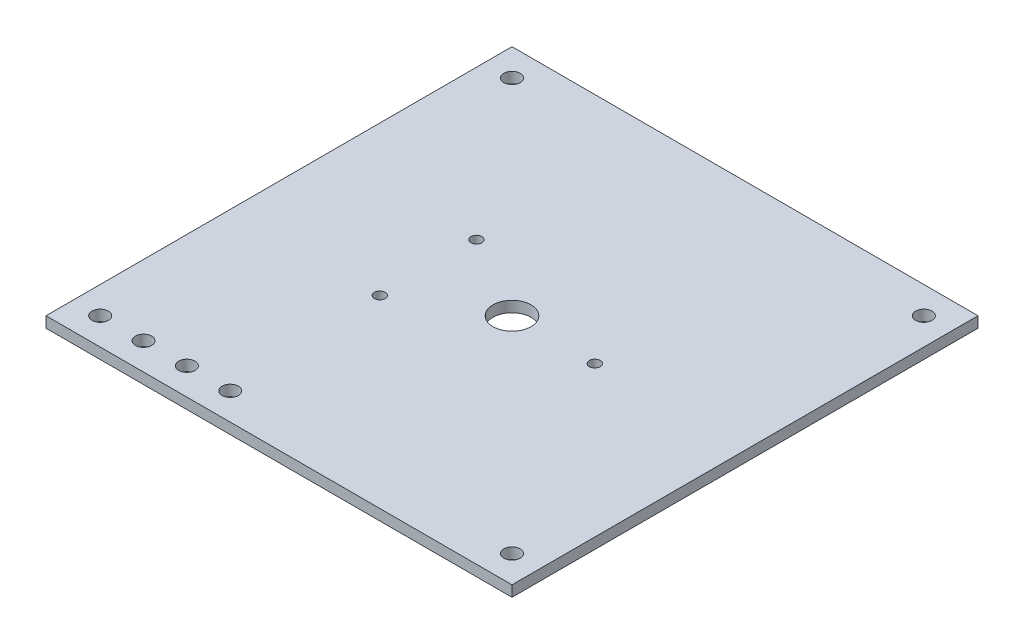
ISO-10303-21;
HEADER;
FILE_DESCRIPTION(('STEP AP214'),'2;1');
FILE_NAME('part.step','',(''),(''),'','','');
FILE_SCHEMA(('AUTOMOTIVE_DESIGN { 1 0 10303 214 1 1 1 1 }'));
ENDSEC;
DATA;
#1=APPLICATION_CONTEXT('core data for automotive mechanical design processes');
#2=APPLICATION_PROTOCOL_DEFINITION('international standard','automotive_design',2000,#1);
#3=PRODUCT_CONTEXT('',#1,'mechanical');
#4=PRODUCT('Part','Part','',(#3));
#5=PRODUCT_RELATED_PRODUCT_CATEGORY('part','',(#4));
#6=PRODUCT_DEFINITION_FORMATION('','',#4);
#7=PRODUCT_DEFINITION_CONTEXT('part definition',#1,'design');
#8=PRODUCT_DEFINITION('design','',#6,#7);
#9=PRODUCT_DEFINITION_SHAPE('','',#8);
#10=(LENGTH_UNIT() NAMED_UNIT(*) SI_UNIT(.MILLI.,.METRE.));
#11=(NAMED_UNIT(*) PLANE_ANGLE_UNIT() SI_UNIT($,.RADIAN.));
#12=(NAMED_UNIT(*) SI_UNIT($,.STERADIAN.) SOLID_ANGLE_UNIT());
#13=UNCERTAINTY_MEASURE_WITH_UNIT(LENGTH_MEASURE(1.E-05),#10,'distance_accuracy_value','');
#14=(GEOMETRIC_REPRESENTATION_CONTEXT(3) GLOBAL_UNCERTAINTY_ASSIGNED_CONTEXT((#13)) GLOBAL_UNIT_ASSIGNED_CONTEXT((#10,
#11,#12)) REPRESENTATION_CONTEXT('',''));
#15=CARTESIAN_POINT('',(0.,0.,0.));
#16=DIRECTION('',(0.,0.,1.));
#17=DIRECTION('',(1.,0.,0.));
#18=AXIS2_PLACEMENT_3D('',#15,#16,#17);
#19=CARTESIAN_POINT('',(0.,6.35,0.));
#20=DIRECTION('',(0.,1.,0.));
#21=DIRECTION('',(0.,0.,1.));
#22=AXIS2_PLACEMENT_3D('',#19,#20,#21);
#23=PLANE('',#22);
#24=CARTESIAN_POINT('',(48.514,6.35,0.));
#25=DIRECTION('',(0.,1.,0.));
#26=DIRECTION('',(0.,0.,1.));
#27=AXIS2_PLACEMENT_3D('',#24,#25,#26);
#28=CIRCLE('',#27,3.175);
#29=CARTESIAN_POINT('',(48.514,6.35,3.175));
#30=VERTEX_POINT('',#29);
#31=EDGE_CURVE('E172',#30,#30,#28,.T.);
#32=ORIENTED_EDGE('',*,*,#31,.F.);
#33=EDGE_LOOP('',(#32));
#34=FACE_BOUND('',#33,.T.);
#35=CARTESIAN_POINT('',(-49.022,6.35,28.446));
#36=DIRECTION('',(0.,1.,0.));
#37=DIRECTION('',(0.,0.,1.));
#38=AXIS2_PLACEMENT_3D('',#35,#36,#37);
#39=CIRCLE('',#38,3.175);
#40=CARTESIAN_POINT('',(-49.022,6.35,31.621));
#41=VERTEX_POINT('',#40);
#42=EDGE_CURVE('E166',#41,#41,#39,.T.);
#43=ORIENTED_EDGE('',*,*,#42,.F.);
#44=EDGE_LOOP('',(#43));
#45=FACE_BOUND('',#44,.T.);
#46=CARTESIAN_POINT('',(-49.0220000000002,6.35,-28.194));
#47=DIRECTION('',(0.,1.,0.));
#48=DIRECTION('',(0.,0.,1.));
#49=AXIS2_PLACEMENT_3D('',#46,#47,#48);
#50=CIRCLE('',#49,3.175);
#51=CARTESIAN_POINT('',(-49.0220000000002,6.35,-25.019));
#52=VERTEX_POINT('',#51);
#53=EDGE_CURVE('E160',#52,#52,#50,.T.);
#54=ORIENTED_EDGE('',*,*,#53,.F.);
#55=EDGE_LOOP('',(#54));
#56=FACE_BOUND('',#55,.T.);
#57=CARTESIAN_POINT('',(-44.45,6.35,120.65));
#58=DIRECTION('',(0.,1.,0.));
#59=DIRECTION('',(0.,0.,1.));
#60=AXIS2_PLACEMENT_3D('',#57,#58,#59);
#61=CIRCLE('',#60,4.7625);
#62=CARTESIAN_POINT('',(-44.45,6.35,125.4125));
#63=VERTEX_POINT('',#62);
#64=EDGE_CURVE('E154',#63,#63,#61,.T.);
#65=ORIENTED_EDGE('',*,*,#64,.F.);
#66=EDGE_LOOP('',(#65));
#67=FACE_BOUND('',#66,.T.);
#68=CARTESIAN_POINT('',(-69.85,6.35,120.65));
#69=DIRECTION('',(0.,1.,0.));
#70=DIRECTION('',(0.,0.,1.));
#71=AXIS2_PLACEMENT_3D('',#68,#69,#70);
#72=CIRCLE('',#71,4.76250000000001);
#73=CARTESIAN_POINT('',(-69.85,6.35,125.4125));
#74=VERTEX_POINT('',#73);
#75=EDGE_CURVE('E148',#74,#74,#72,.T.);
#76=ORIENTED_EDGE('',*,*,#75,.F.);
#77=EDGE_LOOP('',(#76));
#78=FACE_BOUND('',#77,.T.);
#79=CARTESIAN_POINT('',(-95.25,6.35,120.65));
#80=DIRECTION('',(0.,1.,0.));
#81=DIRECTION('',(0.,0.,1.));
#82=AXIS2_PLACEMENT_3D('',#79,#80,#81);
#83=CIRCLE('',#82,4.7625);
#84=CARTESIAN_POINT('',(-95.25,6.35,125.4125));
#85=VERTEX_POINT('',#84);
#86=EDGE_CURVE('E142',#85,#85,#83,.T.);
#87=ORIENTED_EDGE('',*,*,#86,.F.);
#88=EDGE_LOOP('',(#87));
#89=FACE_BOUND('',#88,.T.);
#90=CARTESIAN_POINT('',(120.65,6.35,120.65));
#91=DIRECTION('',(0.,1.,0.));
#92=DIRECTION('',(0.,0.,1.));
#93=AXIS2_PLACEMENT_3D('',#90,#91,#92);
#94=CIRCLE('',#93,4.7625);
#95=CARTESIAN_POINT('',(120.65,6.35,125.4125));
#96=VERTEX_POINT('',#95);
#97=EDGE_CURVE('E136',#96,#96,#94,.T.);
#98=ORIENTED_EDGE('',*,*,#97,.F.);
#99=EDGE_LOOP('',(#98));
#100=FACE_BOUND('',#99,.T.);
#101=CARTESIAN_POINT('',(120.65,6.35,-120.65));
#102=DIRECTION('',(0.,1.,0.));
#103=DIRECTION('',(0.,0.,-1.));
#104=AXIS2_PLACEMENT_3D('',#101,#102,#103);
#105=CIRCLE('',#104,4.7625);
#106=CARTESIAN_POINT('',(120.65,6.35,-125.4125));
#107=VERTEX_POINT('',#106);
#108=EDGE_CURVE('E130',#107,#107,#105,.T.);
#109=ORIENTED_EDGE('',*,*,#108,.F.);
#110=EDGE_LOOP('',(#109));
#111=FACE_BOUND('',#110,.T.);
#112=CARTESIAN_POINT('',(-120.65,6.35,120.65));
#113=DIRECTION('',(0.,1.,0.));
#114=DIRECTION('',(0.,0.,-1.));
#115=AXIS2_PLACEMENT_3D('',#112,#113,#114);
#116=CIRCLE('',#115,4.7625);
#117=CARTESIAN_POINT('',(-120.65,6.35,115.8875));
#118=VERTEX_POINT('',#117);
#119=EDGE_CURVE('E124',#118,#118,#116,.T.);
#120=ORIENTED_EDGE('',*,*,#119,.F.);
#121=EDGE_LOOP('',(#120));
#122=FACE_BOUND('',#121,.T.);
#123=CARTESIAN_POINT('',(-120.65,6.35,-120.65));
#124=DIRECTION('',(0.,1.,0.));
#125=DIRECTION('',(0.,0.,1.));
#126=AXIS2_PLACEMENT_3D('',#123,#124,#125);
#127=CIRCLE('',#126,4.7625);
#128=CARTESIAN_POINT('',(-120.65,6.35,-115.8875));
#129=VERTEX_POINT('',#128);
#130=EDGE_CURVE('E118',#129,#129,#127,.T.);
#131=ORIENTED_EDGE('',*,*,#130,.F.);
#132=EDGE_LOOP('',(#131));
#133=FACE_BOUND('',#132,.T.);
#134=DIRECTION('',(0.,0.,1.));
#135=VECTOR('',#134,1.);
#136=CARTESIAN_POINT('',(-136.525,6.35,136.525));
#137=LINE('',#136,#135);
#138=CARTESIAN_POINT('',(-136.525,6.35,-136.525));
#139=VERTEX_POINT('',#138);
#140=CARTESIAN_POINT('',(-136.525,6.35,136.525));
#141=VERTEX_POINT('',#140);
#142=EDGE_CURVE('E85',#139,#141,#137,.T.);
#143=ORIENTED_EDGE('',*,*,#142,.T.);
#144=DIRECTION('',(1.,0.,0.));
#145=VECTOR('',#144,1.);
#146=CARTESIAN_POINT('',(136.525,6.35,136.525));
#147=LINE('',#146,#145);
#148=CARTESIAN_POINT('',(136.525,6.35,136.525));
#149=VERTEX_POINT('',#148);
#150=EDGE_CURVE('E80',#141,#149,#147,.T.);
#151=ORIENTED_EDGE('',*,*,#150,.T.);
#152=DIRECTION('',(0.,0.,-1.));
#153=VECTOR('',#152,1.);
#154=CARTESIAN_POINT('',(136.525,6.35,136.525));
#155=LINE('',#154,#153);
#156=CARTESIAN_POINT('',(136.525,6.35,-136.525));
#157=VERTEX_POINT('',#156);
#158=EDGE_CURVE('E83',#149,#157,#155,.T.);
#159=ORIENTED_EDGE('',*,*,#158,.T.);
#160=DIRECTION('',(-1.,0.,0.));
#161=VECTOR('',#160,1.);
#162=CARTESIAN_POINT('',(136.525,6.35,-136.525));
#163=LINE('',#162,#161);
#164=EDGE_CURVE('E50',#157,#139,#163,.T.);
#165=ORIENTED_EDGE('',*,*,#164,.T.);
#166=EDGE_LOOP('',(#143,#151,#159,#165));
#167=FACE_BOUND('',#166,.T.);
#168=CARTESIAN_POINT('',(0.,6.35,0.));
#169=DIRECTION('',(0.,1.,0.));
#170=DIRECTION('',(0.,0.,1.));
#171=AXIS2_PLACEMENT_3D('',#168,#169,#170);
#172=CIRCLE('',#171,11.1125);
#173=CARTESIAN_POINT('',(0.,6.35,11.1125));
#174=VERTEX_POINT('',#173);
#175=EDGE_CURVE('E100',#174,#174,#172,.T.);
#176=ORIENTED_EDGE('',*,*,#175,.F.);
#177=EDGE_LOOP('',(#176));
#178=FACE_BOUND('',#177,.T.);
#179=ADVANCED_FACE('F33',(#34,#45,#56,#67,#78,#89,#100,#111,#122,#133,#167,#178),#23,.T.);
#180=CARTESIAN_POINT('',(0.,0.,0.));
#181=DIRECTION('',(0.,1.,0.));
#182=DIRECTION('',(0.,0.,1.));
#183=AXIS2_PLACEMENT_3D('',#180,#181,#182);
#184=PLANE('',#183);
#185=CARTESIAN_POINT('',(48.514,0.,0.));
#186=DIRECTION('',(0.,1.,0.));
#187=DIRECTION('',(0.,0.,1.));
#188=AXIS2_PLACEMENT_3D('',#185,#186,#187);
#189=CIRCLE('',#188,3.175);
#190=CARTESIAN_POINT('',(48.514,0.,3.175));
#191=VERTEX_POINT('',#190);
#192=EDGE_CURVE('E169',#191,#191,#189,.T.);
#193=ORIENTED_EDGE('',*,*,#192,.T.);
#194=EDGE_LOOP('',(#193));
#195=FACE_BOUND('',#194,.T.);
#196=CARTESIAN_POINT('',(-49.022,0.,28.446));
#197=DIRECTION('',(0.,1.,0.));
#198=DIRECTION('',(0.,0.,1.));
#199=AXIS2_PLACEMENT_3D('',#196,#197,#198);
#200=CIRCLE('',#199,3.175);
#201=CARTESIAN_POINT('',(-49.022,0.,31.621));
#202=VERTEX_POINT('',#201);
#203=EDGE_CURVE('E163',#202,#202,#200,.T.);
#204=ORIENTED_EDGE('',*,*,#203,.T.);
#205=EDGE_LOOP('',(#204));
#206=FACE_BOUND('',#205,.T.);
#207=CARTESIAN_POINT('',(-49.0220000000002,0.,-28.194));
#208=DIRECTION('',(0.,1.,0.));
#209=DIRECTION('',(0.,0.,1.));
#210=AXIS2_PLACEMENT_3D('',#207,#208,#209);
#211=CIRCLE('',#210,3.175);
#212=CARTESIAN_POINT('',(-49.0220000000002,0.,-25.019));
#213=VERTEX_POINT('',#212);
#214=EDGE_CURVE('E157',#213,#213,#211,.T.);
#215=ORIENTED_EDGE('',*,*,#214,.T.);
#216=EDGE_LOOP('',(#215));
#217=FACE_BOUND('',#216,.T.);
#218=CARTESIAN_POINT('',(-44.45,0.,120.65));
#219=DIRECTION('',(0.,1.,0.));
#220=DIRECTION('',(0.,0.,1.));
#221=AXIS2_PLACEMENT_3D('',#218,#219,#220);
#222=CIRCLE('',#221,4.7625);
#223=CARTESIAN_POINT('',(-44.45,0.,125.4125));
#224=VERTEX_POINT('',#223);
#225=EDGE_CURVE('E151',#224,#224,#222,.T.);
#226=ORIENTED_EDGE('',*,*,#225,.T.);
#227=EDGE_LOOP('',(#226));
#228=FACE_BOUND('',#227,.T.);
#229=CARTESIAN_POINT('',(-69.85,0.,120.65));
#230=DIRECTION('',(0.,1.,0.));
#231=DIRECTION('',(0.,0.,1.));
#232=AXIS2_PLACEMENT_3D('',#229,#230,#231);
#233=CIRCLE('',#232,4.76250000000001);
#234=CARTESIAN_POINT('',(-69.85,0.,125.4125));
#235=VERTEX_POINT('',#234);
#236=EDGE_CURVE('E145',#235,#235,#233,.T.);
#237=ORIENTED_EDGE('',*,*,#236,.T.);
#238=EDGE_LOOP('',(#237));
#239=FACE_BOUND('',#238,.T.);
#240=CARTESIAN_POINT('',(-95.25,0.,120.65));
#241=DIRECTION('',(0.,1.,0.));
#242=DIRECTION('',(0.,0.,1.));
#243=AXIS2_PLACEMENT_3D('',#240,#241,#242);
#244=CIRCLE('',#243,4.7625);
#245=CARTESIAN_POINT('',(-95.25,0.,125.4125));
#246=VERTEX_POINT('',#245);
#247=EDGE_CURVE('E139',#246,#246,#244,.T.);
#248=ORIENTED_EDGE('',*,*,#247,.T.);
#249=EDGE_LOOP('',(#248));
#250=FACE_BOUND('',#249,.T.);
#251=CARTESIAN_POINT('',(120.65,0.,120.65));
#252=DIRECTION('',(0.,1.,0.));
#253=DIRECTION('',(0.,0.,1.));
#254=AXIS2_PLACEMENT_3D('',#251,#252,#253);
#255=CIRCLE('',#254,4.7625);
#256=CARTESIAN_POINT('',(120.65,0.,125.4125));
#257=VERTEX_POINT('',#256);
#258=EDGE_CURVE('E133',#257,#257,#255,.T.);
#259=ORIENTED_EDGE('',*,*,#258,.T.);
#260=EDGE_LOOP('',(#259));
#261=FACE_BOUND('',#260,.T.);
#262=CARTESIAN_POINT('',(120.65,0.,-120.65));
#263=DIRECTION('',(0.,1.,0.));
#264=DIRECTION('',(0.,0.,-1.));
#265=AXIS2_PLACEMENT_3D('',#262,#263,#264);
#266=CIRCLE('',#265,4.7625);
#267=CARTESIAN_POINT('',(120.65,0.,-125.4125));
#268=VERTEX_POINT('',#267);
#269=EDGE_CURVE('E127',#268,#268,#266,.T.);
#270=ORIENTED_EDGE('',*,*,#269,.T.);
#271=EDGE_LOOP('',(#270));
#272=FACE_BOUND('',#271,.T.);
#273=CARTESIAN_POINT('',(-120.65,0.,120.65));
#274=DIRECTION('',(0.,1.,0.));
#275=DIRECTION('',(0.,0.,-1.));
#276=AXIS2_PLACEMENT_3D('',#273,#274,#275);
#277=CIRCLE('',#276,4.7625);
#278=CARTESIAN_POINT('',(-120.65,0.,115.8875));
#279=VERTEX_POINT('',#278);
#280=EDGE_CURVE('E121',#279,#279,#277,.T.);
#281=ORIENTED_EDGE('',*,*,#280,.T.);
#282=EDGE_LOOP('',(#281));
#283=FACE_BOUND('',#282,.T.);
#284=CARTESIAN_POINT('',(-120.65,0.,-120.65));
#285=DIRECTION('',(0.,1.,0.));
#286=DIRECTION('',(0.,0.,1.));
#287=AXIS2_PLACEMENT_3D('',#284,#285,#286);
#288=CIRCLE('',#287,4.7625);
#289=CARTESIAN_POINT('',(-120.65,0.,-115.8875));
#290=VERTEX_POINT('',#289);
#291=EDGE_CURVE('E115',#290,#290,#288,.T.);
#292=ORIENTED_EDGE('',*,*,#291,.T.);
#293=EDGE_LOOP('',(#292));
#294=FACE_BOUND('',#293,.T.);
#295=DIRECTION('',(0.,0.,1.));
#296=VECTOR('',#295,1.);
#297=CARTESIAN_POINT('',(-136.525,0.,136.525));
#298=LINE('',#297,#296);
#299=CARTESIAN_POINT('',(-136.525,0.,-136.525));
#300=VERTEX_POINT('',#299);
#301=CARTESIAN_POINT('',(-136.525,0.,136.525));
#302=VERTEX_POINT('',#301);
#303=EDGE_CURVE('E97',#300,#302,#298,.T.);
#304=ORIENTED_EDGE('',*,*,#303,.F.);
#305=DIRECTION('',(-1.,0.,0.));
#306=VECTOR('',#305,1.);
#307=CARTESIAN_POINT('',(136.525,0.,-136.525));
#308=LINE('',#307,#306);
#309=CARTESIAN_POINT('',(136.525,0.,-136.525));
#310=VERTEX_POINT('',#309);
#311=EDGE_CURVE('E73',#310,#300,#308,.T.);
#312=ORIENTED_EDGE('',*,*,#311,.F.);
#313=DIRECTION('',(0.,0.,-1.));
#314=VECTOR('',#313,1.);
#315=CARTESIAN_POINT('',(136.525,0.,136.525));
#316=LINE('',#315,#314);
#317=CARTESIAN_POINT('',(136.525,0.,136.525));
#318=VERTEX_POINT('',#317);
#319=EDGE_CURVE('E67',#318,#310,#316,.T.);
#320=ORIENTED_EDGE('',*,*,#319,.F.);
#321=DIRECTION('',(1.,0.,0.));
#322=VECTOR('',#321,1.);
#323=CARTESIAN_POINT('',(136.525,0.,136.525));
#324=LINE('',#323,#322);
#325=EDGE_CURVE('E89',#302,#318,#324,.T.);
#326=ORIENTED_EDGE('',*,*,#325,.F.);
#327=EDGE_LOOP('',(#304,#312,#320,#326));
#328=FACE_BOUND('',#327,.T.);
#329=CARTESIAN_POINT('',(0.,0.,0.));
#330=DIRECTION('',(0.,1.,0.));
#331=DIRECTION('',(0.,0.,1.));
#332=AXIS2_PLACEMENT_3D('',#329,#330,#331);
#333=CIRCLE('',#332,11.1125);
#334=CARTESIAN_POINT('',(0.,0.,11.1125));
#335=VERTEX_POINT('',#334);
#336=EDGE_CURVE('E112',#335,#335,#333,.T.);
#337=ORIENTED_EDGE('',*,*,#336,.T.);
#338=EDGE_LOOP('',(#337));
#339=FACE_BOUND('',#338,.T.);
#340=ADVANCED_FACE('F108',(#195,#206,#217,#228,#239,#250,#261,#272,#283,#294,#328,#339),#184,.F.);
#341=CARTESIAN_POINT('',(-136.525,6.35,136.525));
#342=DIRECTION('',(1.,0.,0.));
#343=DIRECTION('',(0.,0.,-1.));
#344=AXIS2_PLACEMENT_3D('',#341,#342,#343);
#345=PLANE('',#344);
#346=ORIENTED_EDGE('',*,*,#303,.T.);
#347=DIRECTION('',(0.,-1.,0.));
#348=VECTOR('',#347,1.);
#349=CARTESIAN_POINT('',(-136.525,6.35,136.525));
#350=LINE('',#349,#348);
#351=EDGE_CURVE('E11',#141,#302,#350,.T.);
#352=ORIENTED_EDGE('',*,*,#351,.F.);
#353=ORIENTED_EDGE('',*,*,#142,.F.);
#354=DIRECTION('',(0.,-1.,0.));
#355=VECTOR('',#354,1.);
#356=CARTESIAN_POINT('',(-136.525,6.35,-136.525));
#357=LINE('',#356,#355);
#358=EDGE_CURVE('E93',#139,#300,#357,.T.);
#359=ORIENTED_EDGE('',*,*,#358,.T.);
#360=EDGE_LOOP('',(#346,#352,#353,#359));
#361=FACE_BOUND('',#360,.T.);
#362=ADVANCED_FACE('F35',(#361),#345,.F.);
#363=CARTESIAN_POINT('',(136.525,6.35,136.525));
#364=DIRECTION('',(0.,0.,-1.));
#365=DIRECTION('',(-1.,0.,0.));
#366=AXIS2_PLACEMENT_3D('',#363,#364,#365);
#367=PLANE('',#366);
#368=ORIENTED_EDGE('',*,*,#325,.T.);
#369=DIRECTION('',(0.,-1.,0.));
#370=VECTOR('',#369,1.);
#371=CARTESIAN_POINT('',(136.525,6.35,136.525));
#372=LINE('',#371,#370);
#373=EDGE_CURVE('E42',#149,#318,#372,.T.);
#374=ORIENTED_EDGE('',*,*,#373,.F.);
#375=ORIENTED_EDGE('',*,*,#150,.F.);
#376=ORIENTED_EDGE('',*,*,#351,.T.);
#377=EDGE_LOOP('',(#368,#374,#375,#376));
#378=FACE_BOUND('',#377,.T.);
#379=ADVANCED_FACE('F88',(#378),#367,.F.);
#380=CARTESIAN_POINT('',(136.525,6.35,136.525));
#381=DIRECTION('',(-1.,0.,0.));
#382=DIRECTION('',(0.,0.,1.));
#383=AXIS2_PLACEMENT_3D('',#380,#381,#382);
#384=PLANE('',#383);
#385=ORIENTED_EDGE('',*,*,#319,.T.);
#386=DIRECTION('',(0.,-1.,0.));
#387=VECTOR('',#386,1.);
#388=CARTESIAN_POINT('',(136.525,6.35,-136.525));
#389=LINE('',#388,#387);
#390=EDGE_CURVE('E90',#157,#310,#389,.T.);
#391=ORIENTED_EDGE('',*,*,#390,.F.);
#392=ORIENTED_EDGE('',*,*,#158,.F.);
#393=ORIENTED_EDGE('',*,*,#373,.T.);
#394=EDGE_LOOP('',(#385,#391,#392,#393));
#395=FACE_BOUND('',#394,.T.);
#396=ADVANCED_FACE('F91',(#395),#384,.F.);
#397=CARTESIAN_POINT('',(136.525,6.35,-136.525));
#398=DIRECTION('',(0.,0.,1.));
#399=DIRECTION('',(1.,0.,0.));
#400=AXIS2_PLACEMENT_3D('',#397,#398,#399);
#401=PLANE('',#400);
#402=ORIENTED_EDGE('',*,*,#311,.T.);
#403=ORIENTED_EDGE('',*,*,#358,.F.);
#404=ORIENTED_EDGE('',*,*,#164,.F.);
#405=ORIENTED_EDGE('',*,*,#390,.T.);
#406=EDGE_LOOP('',(#402,#403,#404,#405));
#407=FACE_BOUND('',#406,.T.);
#408=ADVANCED_FACE('F105',(#407),#401,.F.);
#409=CARTESIAN_POINT('',(0.,6.35,0.));
#410=DIRECTION('',(0.,-1.,0.));
#411=DIRECTION('',(0.,0.,-1.));
#412=AXIS2_PLACEMENT_3D('',#409,#410,#411);
#413=CYLINDRICAL_SURFACE('',#412,11.1125);
#414=ORIENTED_EDGE('',*,*,#175,.T.);
#415=EDGE_LOOP('',(#414));
#416=FACE_BOUND('',#415,.T.);
#417=ORIENTED_EDGE('',*,*,#336,.F.);
#418=EDGE_LOOP('',(#417));
#419=FACE_BOUND('',#418,.T.);
#420=ADVANCED_FACE('F211',(#416,#419),#413,.F.);
#421=CARTESIAN_POINT('',(-120.65,0.,-120.65));
#422=DIRECTION('',(0.,1.,0.));
#423=DIRECTION('',(0.,0.,1.));
#424=AXIS2_PLACEMENT_3D('',#421,#422,#423);
#425=CYLINDRICAL_SURFACE('',#424,4.7625);
#426=ORIENTED_EDGE('',*,*,#291,.F.);
#427=EDGE_LOOP('',(#426));
#428=FACE_BOUND('',#427,.T.);
#429=ORIENTED_EDGE('',*,*,#130,.T.);
#430=EDGE_LOOP('',(#429));
#431=FACE_BOUND('',#430,.T.);
#432=ADVANCED_FACE('F208',(#428,#431),#425,.F.);
#433=CARTESIAN_POINT('',(-120.65,0.,120.65));
#434=DIRECTION('',(0.,1.,0.));
#435=DIRECTION('',(0.,0.,1.));
#436=AXIS2_PLACEMENT_3D('',#433,#434,#435);
#437=CYLINDRICAL_SURFACE('',#436,4.7625);
#438=ORIENTED_EDGE('',*,*,#280,.F.);
#439=EDGE_LOOP('',(#438));
#440=FACE_BOUND('',#439,.T.);
#441=ORIENTED_EDGE('',*,*,#119,.T.);
#442=EDGE_LOOP('',(#441));
#443=FACE_BOUND('',#442,.T.);
#444=ADVANCED_FACE('F210',(#440,#443),#437,.F.);
#445=CARTESIAN_POINT('',(120.65,0.,-120.65));
#446=DIRECTION('',(0.,1.,0.));
#447=DIRECTION('',(0.,0.,1.));
#448=AXIS2_PLACEMENT_3D('',#445,#446,#447);
#449=CYLINDRICAL_SURFACE('',#448,4.7625);
#450=ORIENTED_EDGE('',*,*,#269,.F.);
#451=EDGE_LOOP('',(#450));
#452=FACE_BOUND('',#451,.T.);
#453=ORIENTED_EDGE('',*,*,#108,.T.);
#454=EDGE_LOOP('',(#453));
#455=FACE_BOUND('',#454,.T.);
#456=ADVANCED_FACE('F218',(#452,#455),#449,.F.);
#457=CARTESIAN_POINT('',(120.65,0.,120.65));
#458=DIRECTION('',(0.,1.,0.));
#459=DIRECTION('',(0.,0.,1.));
#460=AXIS2_PLACEMENT_3D('',#457,#458,#459);
#461=CYLINDRICAL_SURFACE('',#460,4.7625);
#462=ORIENTED_EDGE('',*,*,#258,.F.);
#463=EDGE_LOOP('',(#462));
#464=FACE_BOUND('',#463,.T.);
#465=ORIENTED_EDGE('',*,*,#97,.T.);
#466=EDGE_LOOP('',(#465));
#467=FACE_BOUND('',#466,.T.);
#468=ADVANCED_FACE('F281',(#464,#467),#461,.F.);
#469=CARTESIAN_POINT('',(-95.25,0.,120.65));
#470=DIRECTION('',(0.,1.,0.));
#471=DIRECTION('',(0.,0.,1.));
#472=AXIS2_PLACEMENT_3D('',#469,#470,#471);
#473=CYLINDRICAL_SURFACE('',#472,4.7625);
#474=ORIENTED_EDGE('',*,*,#247,.F.);
#475=EDGE_LOOP('',(#474));
#476=FACE_BOUND('',#475,.T.);
#477=ORIENTED_EDGE('',*,*,#86,.T.);
#478=EDGE_LOOP('',(#477));
#479=FACE_BOUND('',#478,.T.);
#480=ADVANCED_FACE('F271',(#476,#479),#473,.F.);
#481=CARTESIAN_POINT('',(-69.85,0.,120.65));
#482=DIRECTION('',(0.,1.,0.));
#483=DIRECTION('',(0.,0.,1.));
#484=AXIS2_PLACEMENT_3D('',#481,#482,#483);
#485=CYLINDRICAL_SURFACE('',#484,4.76250000000001);
#486=ORIENTED_EDGE('',*,*,#236,.F.);
#487=EDGE_LOOP('',(#486));
#488=FACE_BOUND('',#487,.T.);
#489=ORIENTED_EDGE('',*,*,#75,.T.);
#490=EDGE_LOOP('',(#489));
#491=FACE_BOUND('',#490,.T.);
#492=ADVANCED_FACE('F259',(#488,#491),#485,.F.);
#493=CARTESIAN_POINT('',(-44.45,0.,120.65));
#494=DIRECTION('',(0.,1.,0.));
#495=DIRECTION('',(0.,0.,1.));
#496=AXIS2_PLACEMENT_3D('',#493,#494,#495);
#497=CYLINDRICAL_SURFACE('',#496,4.7625);
#498=ORIENTED_EDGE('',*,*,#225,.F.);
#499=EDGE_LOOP('',(#498));
#500=FACE_BOUND('',#499,.T.);
#501=ORIENTED_EDGE('',*,*,#64,.T.);
#502=EDGE_LOOP('',(#501));
#503=FACE_BOUND('',#502,.T.);
#504=ADVANCED_FACE('F253',(#500,#503),#497,.F.);
#505=CARTESIAN_POINT('',(-49.0220000000002,0.,-28.194));
#506=DIRECTION('',(0.,1.,0.));
#507=DIRECTION('',(0.,0.,1.));
#508=AXIS2_PLACEMENT_3D('',#505,#506,#507);
#509=CYLINDRICAL_SURFACE('',#508,3.175);
#510=ORIENTED_EDGE('',*,*,#214,.F.);
#511=EDGE_LOOP('',(#510));
#512=FACE_BOUND('',#511,.T.);
#513=ORIENTED_EDGE('',*,*,#53,.T.);
#514=EDGE_LOOP('',(#513));
#515=FACE_BOUND('',#514,.T.);
#516=ADVANCED_FACE('F258',(#512,#515),#509,.F.);
#517=CARTESIAN_POINT('',(-49.022,0.,28.446));
#518=DIRECTION('',(0.,1.,0.));
#519=DIRECTION('',(0.,0.,1.));
#520=AXIS2_PLACEMENT_3D('',#517,#518,#519);
#521=CYLINDRICAL_SURFACE('',#520,3.175);
#522=ORIENTED_EDGE('',*,*,#203,.F.);
#523=EDGE_LOOP('',(#522));
#524=FACE_BOUND('',#523,.T.);
#525=ORIENTED_EDGE('',*,*,#42,.T.);
#526=EDGE_LOOP('',(#525));
#527=FACE_BOUND('',#526,.T.);
#528=ADVANCED_FACE('F183',(#524,#527),#521,.F.);
#529=CARTESIAN_POINT('',(48.514,0.,0.));
#530=DIRECTION('',(0.,1.,0.));
#531=DIRECTION('',(0.,0.,1.));
#532=AXIS2_PLACEMENT_3D('',#529,#530,#531);
#533=CYLINDRICAL_SURFACE('',#532,3.175);
#534=ORIENTED_EDGE('',*,*,#192,.F.);
#535=EDGE_LOOP('',(#534));
#536=FACE_BOUND('',#535,.T.);
#537=ORIENTED_EDGE('',*,*,#31,.T.);
#538=EDGE_LOOP('',(#537));
#539=FACE_BOUND('',#538,.T.);
#540=ADVANCED_FACE('F180',(#536,#539),#533,.F.);
#541=CLOSED_SHELL('',(#179,#340,#362,#379,#396,#408,#420,#432,#444,#456,#468,#480,#492,#504,
#516,#528,#540));
#542=MANIFOLD_SOLID_BREP('B2',#541);
#543=ADVANCED_BREP_SHAPE_REPRESENTATION('',(#18,#542),#14);
#544=SHAPE_DEFINITION_REPRESENTATION(#9,#543);
ENDSEC;
END-ISO-10303-21;
